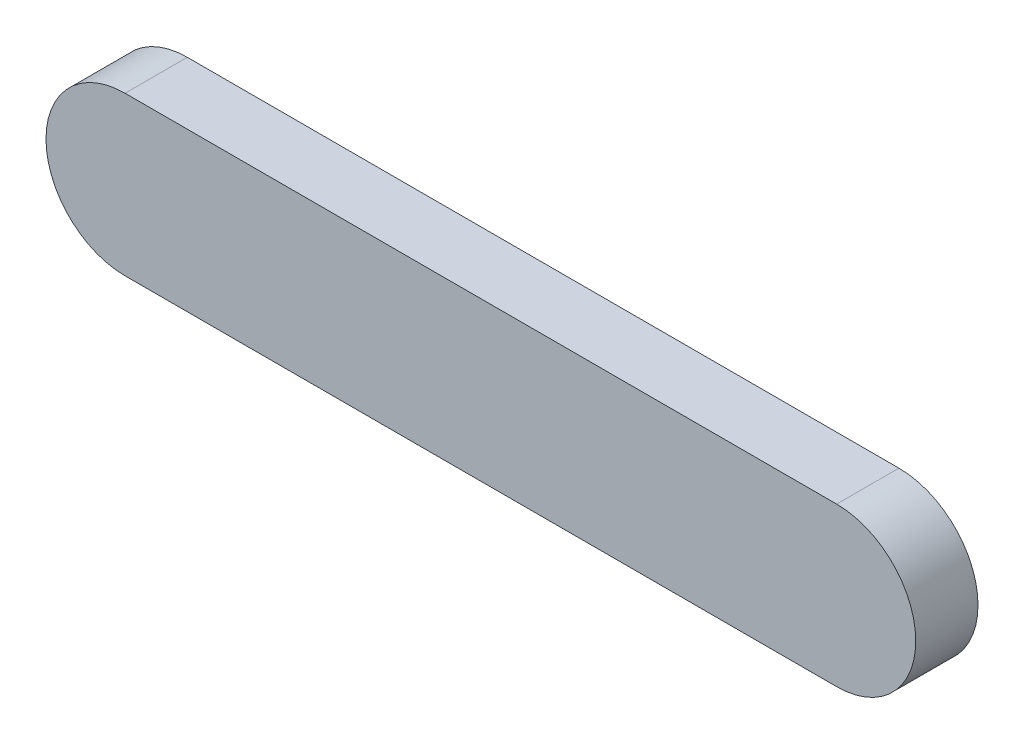
ISO-10303-21;
HEADER;
FILE_DESCRIPTION(('STEP AP214'),'2;1');
FILE_NAME('part.step','',(''),(''),'','','');
FILE_SCHEMA(('AUTOMOTIVE_DESIGN { 1 0 10303 214 1 1 1 1 }'));
ENDSEC;
DATA;
#1=APPLICATION_CONTEXT('core data for automotive mechanical design processes');
#2=APPLICATION_PROTOCOL_DEFINITION('international standard','automotive_design',2000,#1);
#3=PRODUCT_CONTEXT('',#1,'mechanical');
#4=PRODUCT('Part','Part','',(#3));
#5=PRODUCT_RELATED_PRODUCT_CATEGORY('part','',(#4));
#6=PRODUCT_DEFINITION_FORMATION('','',#4);
#7=PRODUCT_DEFINITION_CONTEXT('part definition',#1,'design');
#8=PRODUCT_DEFINITION('design','',#6,#7);
#9=PRODUCT_DEFINITION_SHAPE('','',#8);
#10=(LENGTH_UNIT() NAMED_UNIT(*) SI_UNIT(.MILLI.,.METRE.));
#11=(NAMED_UNIT(*) PLANE_ANGLE_UNIT() SI_UNIT($,.RADIAN.));
#12=(NAMED_UNIT(*) SI_UNIT($,.STERADIAN.) SOLID_ANGLE_UNIT());
#13=UNCERTAINTY_MEASURE_WITH_UNIT(LENGTH_MEASURE(1.E-05),#10,'distance_accuracy_value','');
#14=(GEOMETRIC_REPRESENTATION_CONTEXT(3) GLOBAL_UNCERTAINTY_ASSIGNED_CONTEXT((#13)) GLOBAL_UNIT_ASSIGNED_CONTEXT((#10,
#11,#12)) REPRESENTATION_CONTEXT('',''));
#15=CARTESIAN_POINT('',(0.,0.,0.));
#16=DIRECTION('',(0.,0.,1.));
#17=DIRECTION('',(1.,0.,0.));
#18=AXIS2_PLACEMENT_3D('',#15,#16,#17);
#19=CARTESIAN_POINT('',(89.154,108.331,0.));
#20=DIRECTION('',(0.,1.,0.));
#21=DIRECTION('',(1.,0.,0.));
#22=AXIS2_PLACEMENT_3D('',#19,#20,#21);
#23=PLANE('',#22);
#24=DIRECTION('',(1.,0.,0.));
#25=VECTOR('',#24,1.);
#26=CARTESIAN_POINT('',(89.154,108.331,0.1999996));
#27=LINE('',#26,#25);
#28=CARTESIAN_POINT('',(89.154,108.331,0.1999996));
#29=VERTEX_POINT('',#28);
#30=CARTESIAN_POINT('',(91.44,108.331,0.1999996));
#31=VERTEX_POINT('',#30);
#32=EDGE_CURVE('E11',#29,#31,#27,.T.);
#33=ORIENTED_EDGE('',*,*,#32,.F.);
#34=DIRECTION('',(0.,0.,1.));
#35=VECTOR('',#34,1.);
#36=CARTESIAN_POINT('',(89.154,108.331,0.));
#37=LINE('',#36,#35);
#38=CARTESIAN_POINT('',(89.154,108.331,0.));
#39=VERTEX_POINT('',#38);
#40=EDGE_CURVE('E24',#39,#29,#37,.T.);
#41=ORIENTED_EDGE('',*,*,#40,.F.);
#42=DIRECTION('',(1.,0.,0.));
#43=VECTOR('',#42,1.);
#44=CARTESIAN_POINT('',(89.154,108.331,0.));
#45=LINE('',#44,#43);
#46=CARTESIAN_POINT('',(91.44,108.331,0.));
#47=VERTEX_POINT('',#46);
#48=EDGE_CURVE('E75',#39,#47,#45,.T.);
#49=ORIENTED_EDGE('',*,*,#48,.T.);
#50=DIRECTION('',(0.,0.,1.));
#51=VECTOR('',#50,1.);
#52=CARTESIAN_POINT('',(91.44,108.331,0.));
#53=LINE('',#52,#51);
#54=EDGE_CURVE('E37',#47,#31,#53,.T.);
#55=ORIENTED_EDGE('',*,*,#54,.T.);
#56=EDGE_LOOP('',(#33,#41,#49,#55));
#57=FACE_BOUND('',#56,.T.);
#58=ADVANCED_FACE('F17',(#57),#23,.F.);
#59=CARTESIAN_POINT('',(91.44,108.585,0.));
#60=DIRECTION('',(0.,0.,-1.));
#61=DIRECTION('',(0.,-1.,0.));
#62=AXIS2_PLACEMENT_3D('',#59,#60,#61);
#63=CYLINDRICAL_SURFACE('',#62,0.253999999999995);
#64=CARTESIAN_POINT('',(91.44,108.585,0.1999996));
#65=DIRECTION('',(0.,0.,1.));
#66=DIRECTION('',(0.,-1.,0.));
#67=AXIS2_PLACEMENT_3D('',#64,#65,#66);
#68=CIRCLE('',#67,0.253999999999995);
#69=CARTESIAN_POINT('',(91.44,108.839,0.1999996));
#70=VERTEX_POINT('',#69);
#71=EDGE_CURVE('E83',#31,#70,#68,.T.);
#72=ORIENTED_EDGE('',*,*,#71,.F.);
#73=ORIENTED_EDGE('',*,*,#54,.F.);
#74=CARTESIAN_POINT('',(91.44,108.585,0.));
#75=DIRECTION('',(0.,0.,1.));
#76=DIRECTION('',(0.,-1.,0.));
#77=AXIS2_PLACEMENT_3D('',#74,#75,#76);
#78=CIRCLE('',#77,0.253999999999995);
#79=CARTESIAN_POINT('',(91.44,108.839,0.));
#80=VERTEX_POINT('',#79);
#81=EDGE_CURVE('E81',#47,#80,#78,.T.);
#82=ORIENTED_EDGE('',*,*,#81,.T.);
#83=DIRECTION('',(0.,0.,1.));
#84=VECTOR('',#83,1.);
#85=CARTESIAN_POINT('',(91.44,108.839,0.));
#86=LINE('',#85,#84);
#87=EDGE_CURVE('E67',#80,#70,#86,.T.);
#88=ORIENTED_EDGE('',*,*,#87,.T.);
#89=EDGE_LOOP('',(#72,#73,#82,#88));
#90=FACE_BOUND('',#89,.T.);
#91=ADVANCED_FACE('F89',(#90),#63,.T.);
#92=CARTESIAN_POINT('',(91.44,108.839,0.));
#93=DIRECTION('',(0.,-1.,0.));
#94=DIRECTION('',(-1.,0.,0.));
#95=AXIS2_PLACEMENT_3D('',#92,#93,#94);
#96=PLANE('',#95);
#97=DIRECTION('',(-1.,0.,0.));
#98=VECTOR('',#97,1.);
#99=CARTESIAN_POINT('',(91.44,108.839,0.1999996));
#100=LINE('',#99,#98);
#101=CARTESIAN_POINT('',(89.154,108.839,0.1999996));
#102=VERTEX_POINT('',#101);
#103=EDGE_CURVE('E71',#70,#102,#100,.T.);
#104=ORIENTED_EDGE('',*,*,#103,.F.);
#105=ORIENTED_EDGE('',*,*,#87,.F.);
#106=DIRECTION('',(-1.,0.,0.));
#107=VECTOR('',#106,1.);
#108=CARTESIAN_POINT('',(91.44,108.839,0.));
#109=LINE('',#108,#107);
#110=CARTESIAN_POINT('',(89.154,108.839,0.));
#111=VERTEX_POINT('',#110);
#112=EDGE_CURVE('E63',#80,#111,#109,.T.);
#113=ORIENTED_EDGE('',*,*,#112,.T.);
#114=DIRECTION('',(0.,0.,1.));
#115=VECTOR('',#114,1.);
#116=CARTESIAN_POINT('',(89.154,108.839,0.));
#117=LINE('',#116,#115);
#118=EDGE_CURVE('E53',#111,#102,#117,.T.);
#119=ORIENTED_EDGE('',*,*,#118,.T.);
#120=EDGE_LOOP('',(#104,#105,#113,#119));
#121=FACE_BOUND('',#120,.T.);
#122=ADVANCED_FACE('F66',(#121),#96,.F.);
#123=CARTESIAN_POINT('',(89.154,108.585,0.));
#124=DIRECTION('',(0.,0.,-1.));
#125=DIRECTION('',(0.,1.,0.));
#126=AXIS2_PLACEMENT_3D('',#123,#124,#125);
#127=CYLINDRICAL_SURFACE('',#126,0.253999999999995);
#128=CARTESIAN_POINT('',(89.154,108.585,0.1999996));
#129=DIRECTION('',(0.,0.,1.));
#130=DIRECTION('',(0.,1.,0.));
#131=AXIS2_PLACEMENT_3D('',#128,#129,#130);
#132=CIRCLE('',#131,0.253999999999995);
#133=EDGE_CURVE('E59',#102,#29,#132,.T.);
#134=ORIENTED_EDGE('',*,*,#133,.F.);
#135=ORIENTED_EDGE('',*,*,#118,.F.);
#136=CARTESIAN_POINT('',(89.154,108.585,0.));
#137=DIRECTION('',(0.,0.,1.));
#138=DIRECTION('',(0.,1.,0.));
#139=AXIS2_PLACEMENT_3D('',#136,#137,#138);
#140=CIRCLE('',#139,0.253999999999995);
#141=EDGE_CURVE('E57',#111,#39,#140,.T.);
#142=ORIENTED_EDGE('',*,*,#141,.T.);
#143=ORIENTED_EDGE('',*,*,#40,.T.);
#144=EDGE_LOOP('',(#134,#135,#142,#143));
#145=FACE_BOUND('',#144,.T.);
#146=ADVANCED_FACE('F55',(#145),#127,.T.);
#147=CARTESIAN_POINT('',(89.154,108.331,0.));
#148=DIRECTION('',(0.,0.,-1.));
#149=DIRECTION('',(-1.,0.,0.));
#150=AXIS2_PLACEMENT_3D('',#147,#148,#149);
#151=PLANE('',#150);
#152=ORIENTED_EDGE('',*,*,#141,.F.);
#153=ORIENTED_EDGE('',*,*,#112,.F.);
#154=ORIENTED_EDGE('',*,*,#81,.F.);
#155=ORIENTED_EDGE('',*,*,#48,.F.);
#156=EDGE_LOOP('',(#152,#153,#154,#155));
#157=FACE_BOUND('',#156,.T.);
#158=ADVANCED_FACE('F74',(#157),#151,.T.);
#159=CARTESIAN_POINT('',(89.154,108.331,0.1999996));
#160=DIRECTION('',(0.,0.,-1.));
#161=DIRECTION('',(-1.,0.,0.));
#162=AXIS2_PLACEMENT_3D('',#159,#160,#161);
#163=PLANE('',#162);
#164=ORIENTED_EDGE('',*,*,#32,.T.);
#165=ORIENTED_EDGE('',*,*,#71,.T.);
#166=ORIENTED_EDGE('',*,*,#103,.T.);
#167=ORIENTED_EDGE('',*,*,#133,.T.);
#168=EDGE_LOOP('',(#164,#165,#166,#167));
#169=FACE_BOUND('',#168,.T.);
#170=ADVANCED_FACE('F91',(#169),#163,.F.);
#171=CLOSED_SHELL('',(#58,#91,#122,#146,#158,#170));
#172=MANIFOLD_SOLID_BREP('B1',#171);
#173=ADVANCED_BREP_SHAPE_REPRESENTATION('',(#18,#172),#14);
#174=SHAPE_DEFINITION_REPRESENTATION(#9,#173);
ENDSEC;
END-ISO-10303-21;
